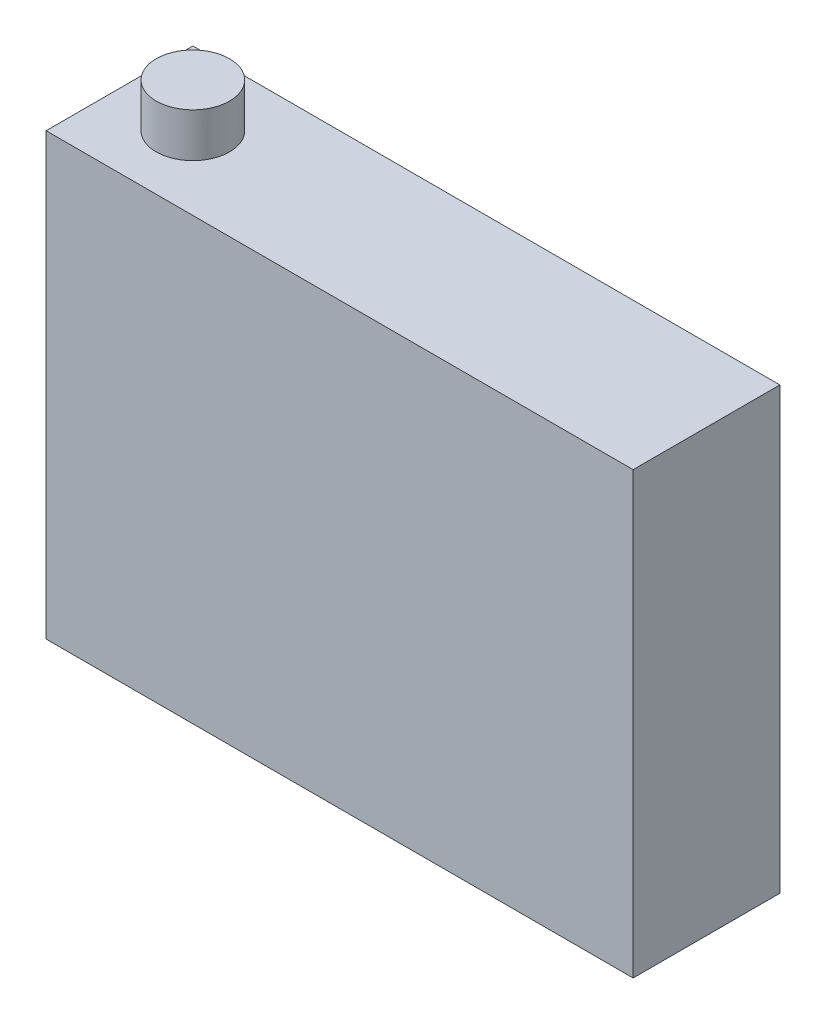
ISO-10303-21;
HEADER;
FILE_DESCRIPTION(('STEP AP214'),'2;1');
FILE_NAME('part.step','',(''),(''),'','','');
FILE_SCHEMA(('AUTOMOTIVE_DESIGN { 1 0 10303 214 1 1 1 1 }'));
ENDSEC;
DATA;
#1=APPLICATION_CONTEXT('core data for automotive mechanical design processes');
#2=APPLICATION_PROTOCOL_DEFINITION('international standard','automotive_design',2000,#1);
#3=PRODUCT_CONTEXT('',#1,'mechanical');
#4=PRODUCT('Part','Part','',(#3));
#5=PRODUCT_RELATED_PRODUCT_CATEGORY('part','',(#4));
#6=PRODUCT_DEFINITION_FORMATION('','',#4);
#7=PRODUCT_DEFINITION_CONTEXT('part definition',#1,'design');
#8=PRODUCT_DEFINITION('design','',#6,#7);
#9=PRODUCT_DEFINITION_SHAPE('','',#8);
#10=(LENGTH_UNIT() NAMED_UNIT(*) SI_UNIT(.MILLI.,.METRE.));
#11=(NAMED_UNIT(*) PLANE_ANGLE_UNIT() SI_UNIT($,.RADIAN.));
#12=(NAMED_UNIT(*) SI_UNIT($,.STERADIAN.) SOLID_ANGLE_UNIT());
#13=UNCERTAINTY_MEASURE_WITH_UNIT(LENGTH_MEASURE(1.E-05),#10,'distance_accuracy_value','');
#14=(GEOMETRIC_REPRESENTATION_CONTEXT(3) GLOBAL_UNCERTAINTY_ASSIGNED_CONTEXT((#13)) GLOBAL_UNIT_ASSIGNED_CONTEXT((#10,
#11,#12)) REPRESENTATION_CONTEXT('',''));
#15=CARTESIAN_POINT('',(0.,0.,0.));
#16=DIRECTION('',(0.,0.,1.));
#17=DIRECTION('',(1.,0.,0.));
#18=AXIS2_PLACEMENT_3D('',#15,#16,#17);
#19=CARTESIAN_POINT('',(0.,30.,0.));
#20=DIRECTION('',(-1.,0.,0.));
#21=DIRECTION('',(0.,0.,1.));
#22=AXIS2_PLACEMENT_3D('',#19,#20,#21);
#23=PLANE('',#22);
#24=DIRECTION('',(0.,0.,-1.));
#25=VECTOR('',#24,1.);
#26=CARTESIAN_POINT('',(0.,0.,0.));
#27=LINE('',#26,#25);
#28=CARTESIAN_POINT('',(0.,0.,10.));
#29=VERTEX_POINT('',#28);
#30=CARTESIAN_POINT('',(0.,0.,0.));
#31=VERTEX_POINT('',#30);
#32=EDGE_CURVE('E98',#29,#31,#27,.T.);
#33=ORIENTED_EDGE('',*,*,#32,.T.);
#34=DIRECTION('',(0.,-1.,0.));
#35=VECTOR('',#34,1.);
#36=CARTESIAN_POINT('',(0.,30.,0.));
#37=LINE('',#36,#35);
#38=CARTESIAN_POINT('',(0.,30.,0.));
#39=VERTEX_POINT('',#38);
#40=EDGE_CURVE('E40',#39,#31,#37,.T.);
#41=ORIENTED_EDGE('',*,*,#40,.F.);
#42=DIRECTION('',(0.,0.,-1.));
#43=VECTOR('',#42,1.);
#44=CARTESIAN_POINT('',(0.,30.,0.));
#45=LINE('',#44,#43);
#46=CARTESIAN_POINT('',(0.,30.,10.));
#47=VERTEX_POINT('',#46);
#48=EDGE_CURVE('E84',#47,#39,#45,.T.);
#49=ORIENTED_EDGE('',*,*,#48,.F.);
#50=DIRECTION('',(0.,-1.,0.));
#51=VECTOR('',#50,1.);
#52=CARTESIAN_POINT('',(0.,30.,10.));
#53=LINE('',#52,#51);
#54=EDGE_CURVE('E94',#47,#29,#53,.T.);
#55=ORIENTED_EDGE('',*,*,#54,.T.);
#56=EDGE_LOOP('',(#33,#41,#49,#55));
#57=FACE_BOUND('',#56,.T.);
#58=ADVANCED_FACE('F32',(#57),#23,.F.);
#59=CARTESIAN_POINT('',(0.,30.,0.));
#60=DIRECTION('',(0.,0.,1.));
#61=DIRECTION('',(1.,0.,0.));
#62=AXIS2_PLACEMENT_3D('',#59,#60,#61);
#63=PLANE('',#62);
#64=DIRECTION('',(-1.,0.,0.));
#65=VECTOR('',#64,1.);
#66=CARTESIAN_POINT('',(0.,0.,0.));
#67=LINE('',#66,#65);
#68=CARTESIAN_POINT('',(-40.,0.,0.));
#69=VERTEX_POINT('',#68);
#70=EDGE_CURVE('E89',#31,#69,#67,.T.);
#71=ORIENTED_EDGE('',*,*,#70,.T.);
#72=DIRECTION('',(0.,-1.,0.));
#73=VECTOR('',#72,1.);
#74=CARTESIAN_POINT('',(-40.,30.,0.));
#75=LINE('',#74,#73);
#76=CARTESIAN_POINT('',(-40.,30.,0.));
#77=VERTEX_POINT('',#76);
#78=EDGE_CURVE('E87',#77,#69,#75,.T.);
#79=ORIENTED_EDGE('',*,*,#78,.F.);
#80=DIRECTION('',(-1.,0.,0.));
#81=VECTOR('',#80,1.);
#82=CARTESIAN_POINT('',(0.,30.,0.));
#83=LINE('',#82,#81);
#84=EDGE_CURVE('E79',#39,#77,#83,.T.);
#85=ORIENTED_EDGE('',*,*,#84,.F.);
#86=ORIENTED_EDGE('',*,*,#40,.T.);
#87=EDGE_LOOP('',(#71,#79,#85,#86));
#88=FACE_BOUND('',#87,.T.);
#89=ADVANCED_FACE('F88',(#88),#63,.F.);
#90=CARTESIAN_POINT('',(-40.,30.,0.));
#91=DIRECTION('',(1.,0.,0.));
#92=DIRECTION('',(0.,0.,-1.));
#93=AXIS2_PLACEMENT_3D('',#90,#91,#92);
#94=PLANE('',#93);
#95=DIRECTION('',(0.,0.,1.));
#96=VECTOR('',#95,1.);
#97=CARTESIAN_POINT('',(-40.,0.,0.));
#98=LINE('',#97,#96);
#99=CARTESIAN_POINT('',(-40.,0.,10.));
#100=VERTEX_POINT('',#99);
#101=EDGE_CURVE('E65',#69,#100,#98,.T.);
#102=ORIENTED_EDGE('',*,*,#101,.T.);
#103=DIRECTION('',(0.,-1.,0.));
#104=VECTOR('',#103,1.);
#105=CARTESIAN_POINT('',(-40.,30.,10.));
#106=LINE('',#105,#104);
#107=CARTESIAN_POINT('',(-40.,30.,10.));
#108=VERTEX_POINT('',#107);
#109=EDGE_CURVE('E90',#108,#100,#106,.T.);
#110=ORIENTED_EDGE('',*,*,#109,.F.);
#111=DIRECTION('',(0.,0.,1.));
#112=VECTOR('',#111,1.);
#113=CARTESIAN_POINT('',(-40.,30.,0.));
#114=LINE('',#113,#112);
#115=EDGE_CURVE('E82',#77,#108,#114,.T.);
#116=ORIENTED_EDGE('',*,*,#115,.F.);
#117=ORIENTED_EDGE('',*,*,#78,.T.);
#118=EDGE_LOOP('',(#102,#110,#116,#117));
#119=FACE_BOUND('',#118,.T.);
#120=ADVANCED_FACE('F92',(#119),#94,.F.);
#121=CARTESIAN_POINT('',(0.,30.,10.));
#122=DIRECTION('',(0.,0.,-1.));
#123=DIRECTION('',(-1.,0.,0.));
#124=AXIS2_PLACEMENT_3D('',#121,#122,#123);
#125=PLANE('',#124);
#126=DIRECTION('',(1.,0.,0.));
#127=VECTOR('',#126,1.);
#128=CARTESIAN_POINT('',(0.,0.,10.));
#129=LINE('',#128,#127);
#130=EDGE_CURVE('E71',#100,#29,#129,.T.);
#131=ORIENTED_EDGE('',*,*,#130,.T.);
#132=ORIENTED_EDGE('',*,*,#54,.F.);
#133=DIRECTION('',(1.,0.,0.));
#134=VECTOR('',#133,1.);
#135=CARTESIAN_POINT('',(0.,30.,10.));
#136=LINE('',#135,#134);
#137=EDGE_CURVE('E48',#108,#47,#136,.T.);
#138=ORIENTED_EDGE('',*,*,#137,.F.);
#139=ORIENTED_EDGE('',*,*,#109,.T.);
#140=EDGE_LOOP('',(#131,#132,#138,#139));
#141=FACE_BOUND('',#140,.T.);
#142=ADVANCED_FACE('F120',(#141),#125,.F.);
#143=CARTESIAN_POINT('',(0.,30.,0.));
#144=DIRECTION('',(0.,-1.,0.));
#145=DIRECTION('',(0.,0.,-1.));
#146=AXIS2_PLACEMENT_3D('',#143,#144,#145);
#147=PLANE('',#146);
#148=CARTESIAN_POINT('',(-35.,30.,5.));
#149=DIRECTION('',(0.,-1.,0.));
#150=DIRECTION('',(0.,0.,-1.));
#151=AXIS2_PLACEMENT_3D('',#148,#149,#150);
#152=CIRCLE('',#151,2.5);
#153=CARTESIAN_POINT('',(-35.,30.,2.5));
#154=VERTEX_POINT('',#153);
#155=EDGE_CURVE('E11',#154,#154,#152,.F.);
#156=ORIENTED_EDGE('',*,*,#155,.F.);
#157=EDGE_LOOP('',(#156));
#158=FACE_BOUND('',#157,.T.);
#159=ORIENTED_EDGE('',*,*,#48,.T.);
#160=ORIENTED_EDGE('',*,*,#84,.T.);
#161=ORIENTED_EDGE('',*,*,#115,.T.);
#162=ORIENTED_EDGE('',*,*,#137,.T.);
#163=EDGE_LOOP('',(#159,#160,#161,#162));
#164=FACE_BOUND('',#163,.T.);
#165=ADVANCED_FACE('F80',(#158,#164),#147,.F.);
#166=CARTESIAN_POINT('',(0.,0.,0.));
#167=DIRECTION('',(0.,-1.,0.));
#168=DIRECTION('',(0.,0.,-1.));
#169=AXIS2_PLACEMENT_3D('',#166,#167,#168);
#170=PLANE('',#169);
#171=ORIENTED_EDGE('',*,*,#32,.F.);
#172=ORIENTED_EDGE('',*,*,#130,.F.);
#173=ORIENTED_EDGE('',*,*,#101,.F.);
#174=ORIENTED_EDGE('',*,*,#70,.F.);
#175=EDGE_LOOP('',(#171,#172,#173,#174));
#176=FACE_BOUND('',#175,.T.);
#177=ADVANCED_FACE('F109',(#176),#170,.T.);
#178=CARTESIAN_POINT('',(-35.,33.,5.));
#179=DIRECTION('',(0.,-1.,0.));
#180=DIRECTION('',(0.,0.,-1.));
#181=AXIS2_PLACEMENT_3D('',#178,#179,#180);
#182=CYLINDRICAL_SURFACE('',#181,2.5);
#183=CARTESIAN_POINT('',(-35.,33.,5.));
#184=DIRECTION('',(0.,1.,0.));
#185=DIRECTION('',(0.,0.,1.));
#186=AXIS2_PLACEMENT_3D('',#183,#184,#185);
#187=CIRCLE('',#186,2.5);
#188=CARTESIAN_POINT('',(-35.,33.,7.5));
#189=VERTEX_POINT('',#188);
#190=EDGE_CURVE('E101',#189,#189,#187,.T.);
#191=ORIENTED_EDGE('',*,*,#190,.F.);
#192=EDGE_LOOP('',(#191));
#193=FACE_BOUND('',#192,.T.);
#194=ORIENTED_EDGE('',*,*,#155,.T.);
#195=EDGE_LOOP('',(#194));
#196=FACE_BOUND('',#195,.T.);
#197=ADVANCED_FACE('F111',(#193,#196),#182,.T.);
#198=CARTESIAN_POINT('',(-35.,33.,5.));
#199=DIRECTION('',(0.,1.,0.));
#200=DIRECTION('',(0.,0.,1.));
#201=AXIS2_PLACEMENT_3D('',#198,#199,#200);
#202=PLANE('',#201);
#203=ORIENTED_EDGE('',*,*,#190,.T.);
#204=EDGE_LOOP('',(#203));
#205=FACE_BOUND('',#204,.T.);
#206=ADVANCED_FACE('F117',(#205),#202,.T.);
#207=CLOSED_SHELL('',(#58,#89,#120,#142,#165,#177,#197,#206));
#208=MANIFOLD_SOLID_BREP('B2',#207);
#209=ADVANCED_BREP_SHAPE_REPRESENTATION('',(#18,#208),#14);
#210=SHAPE_DEFINITION_REPRESENTATION(#9,#209);
ENDSEC;
END-ISO-10303-21;
